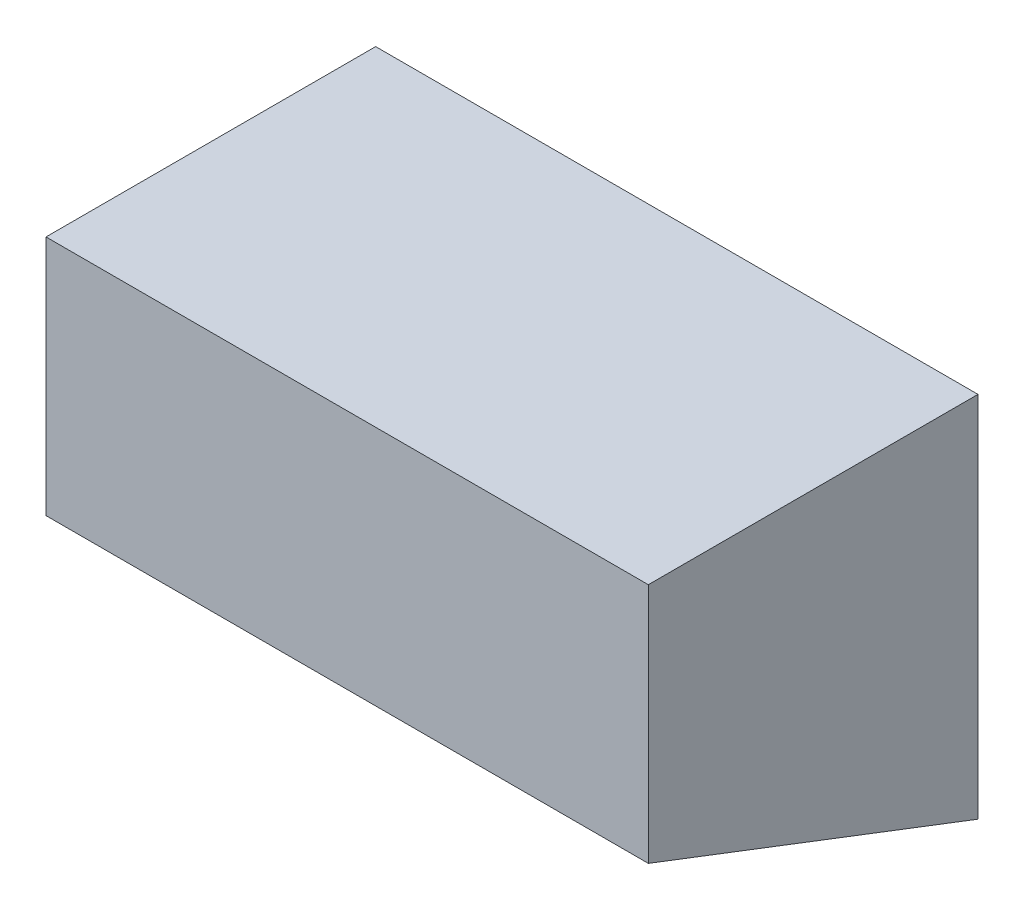
ISO-10303-21;
HEADER;
FILE_DESCRIPTION(('STEP AP214'),'2;1');
FILE_NAME('part.step','',(''),(''),'','','');
FILE_SCHEMA(('AUTOMOTIVE_DESIGN { 1 0 10303 214 1 1 1 1 }'));
ENDSEC;
DATA;
#1=APPLICATION_CONTEXT('core data for automotive mechanical design processes');
#2=APPLICATION_PROTOCOL_DEFINITION('international standard','automotive_design',2000,#1);
#3=PRODUCT_CONTEXT('',#1,'mechanical');
#4=PRODUCT('Part','Part','',(#3));
#5=PRODUCT_RELATED_PRODUCT_CATEGORY('part','',(#4));
#6=PRODUCT_DEFINITION_FORMATION('','',#4);
#7=PRODUCT_DEFINITION_CONTEXT('part definition',#1,'design');
#8=PRODUCT_DEFINITION('design','',#6,#7);
#9=PRODUCT_DEFINITION_SHAPE('','',#8);
#10=(LENGTH_UNIT() NAMED_UNIT(*) SI_UNIT(.MILLI.,.METRE.));
#11=(NAMED_UNIT(*) PLANE_ANGLE_UNIT() SI_UNIT($,.RADIAN.));
#12=(NAMED_UNIT(*) SI_UNIT($,.STERADIAN.) SOLID_ANGLE_UNIT());
#13=UNCERTAINTY_MEASURE_WITH_UNIT(LENGTH_MEASURE(1.E-05),#10,'distance_accuracy_value','');
#14=(GEOMETRIC_REPRESENTATION_CONTEXT(3) GLOBAL_UNCERTAINTY_ASSIGNED_CONTEXT((#13)) GLOBAL_UNIT_ASSIGNED_CONTEXT((#10,
#11,#12)) REPRESENTATION_CONTEXT('',''));
#15=CARTESIAN_POINT('',(0.,0.,0.));
#16=DIRECTION('',(0.,0.,1.));
#17=DIRECTION('',(1.,0.,0.));
#18=AXIS2_PLACEMENT_3D('',#15,#16,#17);
#19=CARTESIAN_POINT('',(37.,45.2,1.54823793774373E-13));
#20=DIRECTION('',(0.,0.,1.));
#21=DIRECTION('',(0.,-1.,0.));
#22=AXIS2_PLACEMENT_3D('',#19,#20,#21);
#23=PLANE('',#22);
#24=DIRECTION('',(0.,1.,0.));
#25=VECTOR('',#24,1.);
#26=CARTESIAN_POINT('',(-37.,45.2,1.54823793774373E-13));
#27=LINE('',#26,#25);
#28=CARTESIAN_POINT('',(-37.,0.,0.));
#29=VERTEX_POINT('',#28);
#30=CARTESIAN_POINT('',(-37.,45.2,1.54823793774373E-13));
#31=VERTEX_POINT('',#30);
#32=EDGE_CURVE('E119',#29,#31,#27,.T.);
#33=ORIENTED_EDGE('',*,*,#32,.T.);
#34=DIRECTION('',(-1.,0.,0.));
#35=VECTOR('',#34,1.);
#36=CARTESIAN_POINT('',(37.,45.2,1.54823793774373E-13));
#37=LINE('',#36,#35);
#38=CARTESIAN_POINT('',(37.,45.2,1.54823793774373E-13));
#39=VERTEX_POINT('',#38);
#40=EDGE_CURVE('E11',#39,#31,#37,.T.);
#41=ORIENTED_EDGE('',*,*,#40,.F.);
#42=DIRECTION('',(0.,1.,0.));
#43=VECTOR('',#42,1.);
#44=CARTESIAN_POINT('',(37.,45.2,1.54823793774373E-13));
#45=LINE('',#44,#43);
#46=CARTESIAN_POINT('',(37.,0.,0.));
#47=VERTEX_POINT('',#46);
#48=EDGE_CURVE('E102',#47,#39,#45,.T.);
#49=ORIENTED_EDGE('',*,*,#48,.F.);
#50=DIRECTION('',(-1.,0.,0.));
#51=VECTOR('',#50,1.);
#52=CARTESIAN_POINT('',(37.,0.,0.));
#53=LINE('',#52,#51);
#54=EDGE_CURVE('E115',#47,#29,#53,.T.);
#55=ORIENTED_EDGE('',*,*,#54,.T.);
#56=EDGE_LOOP('',(#33,#41,#49,#55));
#57=FACE_BOUND('',#56,.T.);
#58=ADVANCED_FACE('F42',(#57),#23,.F.);
#59=CARTESIAN_POINT('',(37.,45.1999999999999,40.5000000000002));
#60=DIRECTION('',(0.,-1.,0.));
#61=DIRECTION('',(0.,0.,-1.));
#62=AXIS2_PLACEMENT_3D('',#59,#60,#61);
#63=PLANE('',#62);
#64=DIRECTION('',(0.,0.,1.));
#65=VECTOR('',#64,1.);
#66=CARTESIAN_POINT('',(-37.,45.1999999999999,40.5000000000002));
#67=LINE('',#66,#65);
#68=CARTESIAN_POINT('',(-37.,45.1999999999999,40.5000000000002));
#69=VERTEX_POINT('',#68);
#70=EDGE_CURVE('E107',#31,#69,#67,.T.);
#71=ORIENTED_EDGE('',*,*,#70,.T.);
#72=DIRECTION('',(-1.,0.,0.));
#73=VECTOR('',#72,1.);
#74=CARTESIAN_POINT('',(37.,45.1999999999999,40.5000000000002));
#75=LINE('',#74,#73);
#76=CARTESIAN_POINT('',(37.,45.1999999999999,40.5000000000002));
#77=VERTEX_POINT('',#76);
#78=EDGE_CURVE('E51',#77,#69,#75,.T.);
#79=ORIENTED_EDGE('',*,*,#78,.F.);
#80=DIRECTION('',(0.,0.,1.));
#81=VECTOR('',#80,1.);
#82=CARTESIAN_POINT('',(37.,45.1999999999999,40.5000000000002));
#83=LINE('',#82,#81);
#84=EDGE_CURVE('E97',#39,#77,#83,.T.);
#85=ORIENTED_EDGE('',*,*,#84,.F.);
#86=ORIENTED_EDGE('',*,*,#40,.T.);
#87=EDGE_LOOP('',(#71,#79,#85,#86));
#88=FACE_BOUND('',#87,.T.);
#89=ADVANCED_FACE('F106',(#88),#63,.F.);
#90=CARTESIAN_POINT('',(37.,15.5464934189345,40.5));
#91=DIRECTION('',(0.,0.,-1.));
#92=DIRECTION('',(0.,1.,0.));
#93=AXIS2_PLACEMENT_3D('',#90,#91,#92);
#94=PLANE('',#93);
#95=DIRECTION('',(0.,-1.,0.));
#96=VECTOR('',#95,1.);
#97=CARTESIAN_POINT('',(-37.,15.5464934189345,40.5));
#98=LINE('',#97,#96);
#99=CARTESIAN_POINT('',(-37.,15.5464934189345,40.5));
#100=VERTEX_POINT('',#99);
#101=EDGE_CURVE('E83',#69,#100,#98,.T.);
#102=ORIENTED_EDGE('',*,*,#101,.T.);
#103=DIRECTION('',(-1.,0.,0.));
#104=VECTOR('',#103,1.);
#105=CARTESIAN_POINT('',(37.,15.5464934189345,40.5));
#106=LINE('',#105,#104);
#107=CARTESIAN_POINT('',(37.,15.5464934189345,40.5));
#108=VERTEX_POINT('',#107);
#109=EDGE_CURVE('E109',#108,#100,#106,.T.);
#110=ORIENTED_EDGE('',*,*,#109,.F.);
#111=DIRECTION('',(0.,-1.,0.));
#112=VECTOR('',#111,1.);
#113=CARTESIAN_POINT('',(37.,15.5464934189345,40.5));
#114=LINE('',#113,#112);
#115=EDGE_CURVE('E100',#77,#108,#114,.T.);
#116=ORIENTED_EDGE('',*,*,#115,.F.);
#117=ORIENTED_EDGE('',*,*,#78,.T.);
#118=EDGE_LOOP('',(#102,#110,#116,#117));
#119=FACE_BOUND('',#118,.T.);
#120=ADVANCED_FACE('F110',(#119),#94,.F.);
#121=CARTESIAN_POINT('',(37.,0.,0.));
#122=DIRECTION('',(0.,0.933580426497201,-0.358367949545303));
#123=DIRECTION('',(0.,0.358367949545303,0.933580426497201));
#124=AXIS2_PLACEMENT_3D('',#121,#122,#123);
#125=PLANE('',#124);
#126=DIRECTION('',(0.,-0.358367949545303,-0.933580426497201));
#127=VECTOR('',#126,1.);
#128=CARTESIAN_POINT('',(-37.,0.,0.));
#129=LINE('',#128,#127);
#130=EDGE_CURVE('E90',#100,#29,#129,.T.);
#131=ORIENTED_EDGE('',*,*,#130,.T.);
#132=ORIENTED_EDGE('',*,*,#54,.F.);
#133=DIRECTION('',(0.,-0.358367949545303,-0.933580426497201));
#134=VECTOR('',#133,1.);
#135=CARTESIAN_POINT('',(37.,0.,0.));
#136=LINE('',#135,#134);
#137=EDGE_CURVE('E62',#108,#47,#136,.T.);
#138=ORIENTED_EDGE('',*,*,#137,.F.);
#139=ORIENTED_EDGE('',*,*,#109,.T.);
#140=EDGE_LOOP('',(#131,#132,#138,#139));
#141=FACE_BOUND('',#140,.T.);
#142=ADVANCED_FACE('F131',(#141),#125,.F.);
#143=CARTESIAN_POINT('',(37.,0.,0.));
#144=DIRECTION('',(1.,0.,0.));
#145=DIRECTION('',(0.,0.,-1.));
#146=AXIS2_PLACEMENT_3D('',#143,#144,#145);
#147=PLANE('',#146);
#148=ORIENTED_EDGE('',*,*,#48,.T.);
#149=ORIENTED_EDGE('',*,*,#84,.T.);
#150=ORIENTED_EDGE('',*,*,#115,.T.);
#151=ORIENTED_EDGE('',*,*,#137,.T.);
#152=EDGE_LOOP('',(#148,#149,#150,#151));
#153=FACE_BOUND('',#152,.T.);
#154=ADVANCED_FACE('F98',(#153),#147,.T.);
#155=CARTESIAN_POINT('',(-37.,0.,0.));
#156=DIRECTION('',(1.,0.,0.));
#157=DIRECTION('',(0.,0.,-1.));
#158=AXIS2_PLACEMENT_3D('',#155,#156,#157);
#159=PLANE('',#158);
#160=ORIENTED_EDGE('',*,*,#32,.F.);
#161=ORIENTED_EDGE('',*,*,#130,.F.);
#162=ORIENTED_EDGE('',*,*,#101,.F.);
#163=ORIENTED_EDGE('',*,*,#70,.F.);
#164=EDGE_LOOP('',(#160,#161,#162,#163));
#165=FACE_BOUND('',#164,.T.);
#166=ADVANCED_FACE('F134',(#165),#159,.F.);
#167=CLOSED_SHELL('',(#58,#89,#120,#142,#154,#166));
#168=MANIFOLD_SOLID_BREP('B2',#167);
#169=ADVANCED_BREP_SHAPE_REPRESENTATION('',(#18,#168),#14);
#170=SHAPE_DEFINITION_REPRESENTATION(#9,#169);
ENDSEC;
END-ISO-10303-21;
